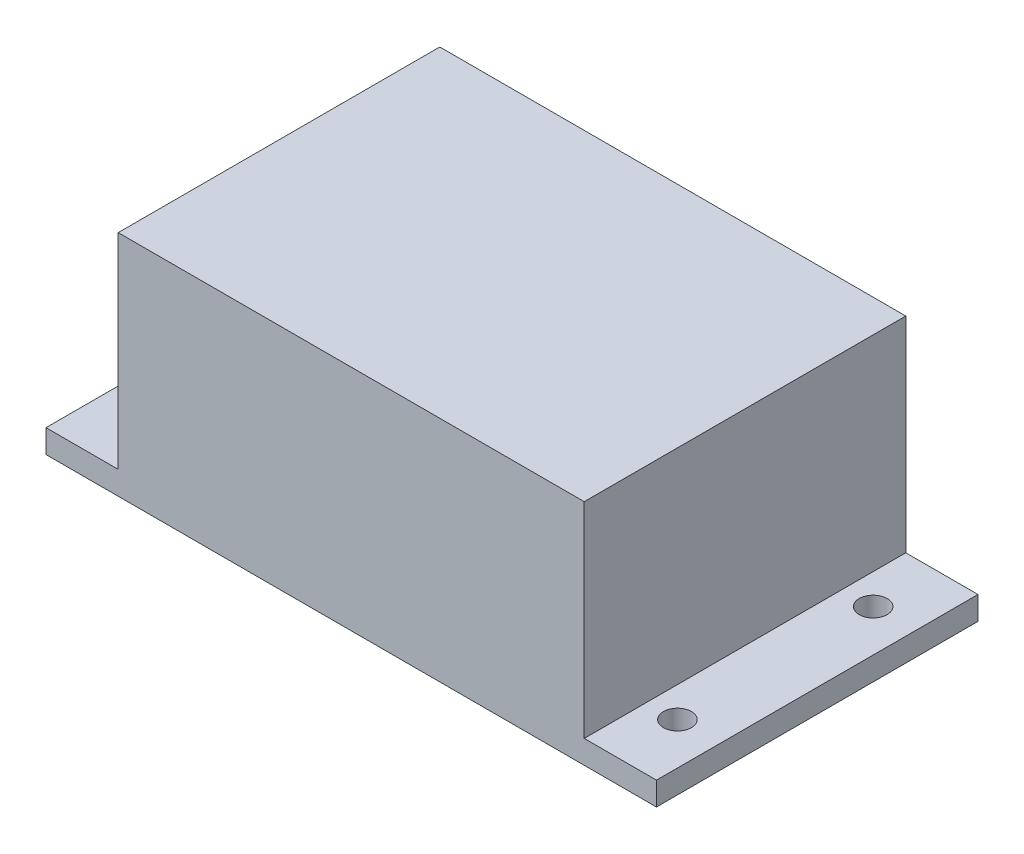
ISO-10303-21;
HEADER;
FILE_DESCRIPTION(('STEP AP214'),'2;1');
FILE_NAME('part.step','',(''),(''),'','','');
FILE_SCHEMA(('AUTOMOTIVE_DESIGN { 1 0 10303 214 1 1 1 1 }'));
ENDSEC;
DATA;
#1=APPLICATION_CONTEXT('core data for automotive mechanical design processes');
#2=APPLICATION_PROTOCOL_DEFINITION('international standard','automotive_design',2000,#1);
#3=PRODUCT_CONTEXT('',#1,'mechanical');
#4=PRODUCT('Part','Part','',(#3));
#5=PRODUCT_RELATED_PRODUCT_CATEGORY('part','',(#4));
#6=PRODUCT_DEFINITION_FORMATION('','',#4);
#7=PRODUCT_DEFINITION_CONTEXT('part definition',#1,'design');
#8=PRODUCT_DEFINITION('design','',#6,#7);
#9=PRODUCT_DEFINITION_SHAPE('','',#8);
#10=(LENGTH_UNIT() NAMED_UNIT(*) SI_UNIT(.MILLI.,.METRE.));
#11=(NAMED_UNIT(*) PLANE_ANGLE_UNIT() SI_UNIT($,.RADIAN.));
#12=(NAMED_UNIT(*) SI_UNIT($,.STERADIAN.) SOLID_ANGLE_UNIT());
#13=UNCERTAINTY_MEASURE_WITH_UNIT(LENGTH_MEASURE(1.E-05),#10,'distance_accuracy_value','');
#14=(GEOMETRIC_REPRESENTATION_CONTEXT(3) GLOBAL_UNCERTAINTY_ASSIGNED_CONTEXT((#13)) GLOBAL_UNIT_ASSIGNED_CONTEXT((#10,
#11,#12)) REPRESENTATION_CONTEXT('',''));
#15=CARTESIAN_POINT('',(0.,0.,0.));
#16=DIRECTION('',(0.,0.,1.));
#17=DIRECTION('',(1.,0.,0.));
#18=AXIS2_PLACEMENT_3D('',#15,#16,#17);
#19=CARTESIAN_POINT('',(0.,5.,-34.5));
#20=DIRECTION('',(0.,0.,-1.));
#21=DIRECTION('',(-1.,0.,0.));
#22=AXIS2_PLACEMENT_3D('',#19,#20,#21);
#23=PLANE('',#22);
#24=DIRECTION('',(1.,0.,0.));
#25=VECTOR('',#24,1.);
#26=CARTESIAN_POINT('',(0.,0.,-34.5));
#27=LINE('',#26,#25);
#28=CARTESIAN_POINT('',(-65.5,0.,-34.5));
#29=VERTEX_POINT('',#28);
#30=CARTESIAN_POINT('',(65.5,0.,-34.5));
#31=VERTEX_POINT('',#30);
#32=EDGE_CURVE('E180',#29,#31,#27,.T.);
#33=ORIENTED_EDGE('',*,*,#32,.F.);
#34=DIRECTION('',(0.,-1.,0.));
#35=VECTOR('',#34,1.);
#36=CARTESIAN_POINT('',(-65.5,5.,-34.5));
#37=LINE('',#36,#35);
#38=CARTESIAN_POINT('',(-65.5,5.,-34.5));
#39=VERTEX_POINT('',#38);
#40=EDGE_CURVE('E11',#39,#29,#37,.T.);
#41=ORIENTED_EDGE('',*,*,#40,.F.);
#42=DIRECTION('',(1.,0.,0.));
#43=VECTOR('',#42,1.);
#44=CARTESIAN_POINT('',(0.,5.,-34.5));
#45=LINE('',#44,#43);
#46=CARTESIAN_POINT('',(-50.,5.,-34.5));
#47=VERTEX_POINT('',#46);
#48=EDGE_CURVE('E169',#39,#47,#45,.T.);
#49=ORIENTED_EDGE('',*,*,#48,.T.);
#50=DIRECTION('',(0.,-1.,0.));
#51=VECTOR('',#50,1.);
#52=CARTESIAN_POINT('',(-50.,49.,-34.5));
#53=LINE('',#52,#51);
#54=CARTESIAN_POINT('',(-50.,49.,-34.5));
#55=VERTEX_POINT('',#54);
#56=EDGE_CURVE('E155',#55,#47,#53,.T.);
#57=ORIENTED_EDGE('',*,*,#56,.F.);
#58=DIRECTION('',(1.,0.,0.));
#59=VECTOR('',#58,1.);
#60=CARTESIAN_POINT('',(0.,49.,-34.5));
#61=LINE('',#60,#59);
#62=CARTESIAN_POINT('',(50.,49.,-34.5));
#63=VERTEX_POINT('',#62);
#64=EDGE_CURVE('E147',#55,#63,#61,.T.);
#65=ORIENTED_EDGE('',*,*,#64,.T.);
#66=DIRECTION('',(0.,-1.,0.));
#67=VECTOR('',#66,1.);
#68=CARTESIAN_POINT('',(50.,49.,-34.5));
#69=LINE('',#68,#67);
#70=CARTESIAN_POINT('',(50.,5.,-34.5));
#71=VERTEX_POINT('',#70);
#72=EDGE_CURVE('E158',#63,#71,#69,.T.);
#73=ORIENTED_EDGE('',*,*,#72,.T.);
#74=DIRECTION('',(1.,0.,0.));
#75=VECTOR('',#74,1.);
#76=CARTESIAN_POINT('',(0.,5.,-34.5));
#77=LINE('',#76,#75);
#78=CARTESIAN_POINT('',(65.5,5.,-34.5));
#79=VERTEX_POINT('',#78);
#80=EDGE_CURVE('E125',#71,#79,#77,.T.);
#81=ORIENTED_EDGE('',*,*,#80,.T.);
#82=DIRECTION('',(0.,-1.,0.));
#83=VECTOR('',#82,1.);
#84=CARTESIAN_POINT('',(65.5,5.,-34.5));
#85=LINE('',#84,#83);
#86=EDGE_CURVE('E132',#79,#31,#85,.T.);
#87=ORIENTED_EDGE('',*,*,#86,.T.);
#88=EDGE_LOOP('',(#33,#41,#49,#57,#65,#73,#81,#87));
#89=FACE_BOUND('',#88,.T.);
#90=ADVANCED_FACE('F34',(#89),#23,.T.);
#91=CARTESIAN_POINT('',(-65.5,5.,0.));
#92=DIRECTION('',(-1.,0.,0.));
#93=DIRECTION('',(0.,0.,1.));
#94=AXIS2_PLACEMENT_3D('',#91,#92,#93);
#95=PLANE('',#94);
#96=DIRECTION('',(0.,0.,-1.));
#97=VECTOR('',#96,1.);
#98=CARTESIAN_POINT('',(-65.5,0.,0.));
#99=LINE('',#98,#97);
#100=CARTESIAN_POINT('',(-65.5,0.,34.5));
#101=VERTEX_POINT('',#100);
#102=EDGE_CURVE('E182',#101,#29,#99,.T.);
#103=ORIENTED_EDGE('',*,*,#102,.F.);
#104=DIRECTION('',(0.,-1.,0.));
#105=VECTOR('',#104,1.);
#106=CARTESIAN_POINT('',(-65.5,5.,34.5));
#107=LINE('',#106,#105);
#108=CARTESIAN_POINT('',(-65.5,5.,34.5));
#109=VERTEX_POINT('',#108);
#110=EDGE_CURVE('E42',#109,#101,#107,.T.);
#111=ORIENTED_EDGE('',*,*,#110,.F.);
#112=DIRECTION('',(0.,0.,-1.));
#113=VECTOR('',#112,1.);
#114=CARTESIAN_POINT('',(-65.5,5.,0.));
#115=LINE('',#114,#113);
#116=EDGE_CURVE('E171',#109,#39,#115,.T.);
#117=ORIENTED_EDGE('',*,*,#116,.T.);
#118=ORIENTED_EDGE('',*,*,#40,.T.);
#119=EDGE_LOOP('',(#103,#111,#117,#118));
#120=FACE_BOUND('',#119,.T.);
#121=ADVANCED_FACE('F203',(#120),#95,.T.);
#122=CARTESIAN_POINT('',(-56.5,5.,21.));
#123=DIRECTION('',(0.,-1.,0.));
#124=DIRECTION('',(0.,0.,-1.));
#125=AXIS2_PLACEMENT_3D('',#122,#123,#124);
#126=CYLINDRICAL_SURFACE('',#125,3.00000000000001);
#127=CARTESIAN_POINT('',(-56.5,5.,21.));
#128=DIRECTION('',(0.,1.,0.));
#129=DIRECTION('',(0.,0.,1.));
#130=AXIS2_PLACEMENT_3D('',#127,#128,#129);
#131=CIRCLE('',#130,3.00000000000001);
#132=CARTESIAN_POINT('',(-56.5,5.,24.));
#133=VERTEX_POINT('',#132);
#134=EDGE_CURVE('E164',#133,#133,#131,.T.);
#135=ORIENTED_EDGE('',*,*,#134,.T.);
#136=EDGE_LOOP('',(#135));
#137=FACE_BOUND('',#136,.T.);
#138=CARTESIAN_POINT('',(-56.5,0.,21.));
#139=DIRECTION('',(0.,1.,0.));
#140=DIRECTION('',(0.,0.,1.));
#141=AXIS2_PLACEMENT_3D('',#138,#139,#140);
#142=CIRCLE('',#141,3.00000000000001);
#143=CARTESIAN_POINT('',(-56.5,0.,24.));
#144=VERTEX_POINT('',#143);
#145=EDGE_CURVE('E177',#144,#144,#142,.T.);
#146=ORIENTED_EDGE('',*,*,#145,.F.);
#147=EDGE_LOOP('',(#146));
#148=FACE_BOUND('',#147,.T.);
#149=ADVANCED_FACE('F205',(#137,#148),#126,.F.);
#150=CARTESIAN_POINT('',(-56.5,5.,-21.));
#151=DIRECTION('',(0.,-1.,0.));
#152=DIRECTION('',(0.,0.,-1.));
#153=AXIS2_PLACEMENT_3D('',#150,#151,#152);
#154=CYLINDRICAL_SURFACE('',#153,3.00000000000001);
#155=CARTESIAN_POINT('',(-56.5,5.,-21.));
#156=DIRECTION('',(0.,1.,0.));
#157=DIRECTION('',(0.,0.,1.));
#158=AXIS2_PLACEMENT_3D('',#155,#156,#157);
#159=CIRCLE('',#158,3.00000000000001);
#160=CARTESIAN_POINT('',(-56.5,5.,-18.));
#161=VERTEX_POINT('',#160);
#162=EDGE_CURVE('E161',#161,#161,#159,.T.);
#163=ORIENTED_EDGE('',*,*,#162,.T.);
#164=EDGE_LOOP('',(#163));
#165=FACE_BOUND('',#164,.T.);
#166=CARTESIAN_POINT('',(-56.5,0.,-21.));
#167=DIRECTION('',(0.,1.,0.));
#168=DIRECTION('',(0.,0.,1.));
#169=AXIS2_PLACEMENT_3D('',#166,#167,#168);
#170=CIRCLE('',#169,3.00000000000001);
#171=CARTESIAN_POINT('',(-56.5,0.,-18.));
#172=VERTEX_POINT('',#171);
#173=EDGE_CURVE('E160',#172,#172,#170,.T.);
#174=ORIENTED_EDGE('',*,*,#173,.F.);
#175=EDGE_LOOP('',(#174));
#176=FACE_BOUND('',#175,.T.);
#177=ADVANCED_FACE('F36',(#165,#176),#154,.F.);
#178=CARTESIAN_POINT('',(0.,5.,34.5));
#179=DIRECTION('',(0.,0.,-1.));
#180=DIRECTION('',(-1.,0.,0.));
#181=AXIS2_PLACEMENT_3D('',#178,#179,#180);
#182=PLANE('',#181);
#183=DIRECTION('',(1.,0.,0.));
#184=VECTOR('',#183,1.);
#185=CARTESIAN_POINT('',(0.,0.,34.5));
#186=LINE('',#185,#184);
#187=CARTESIAN_POINT('',(65.5,0.,34.5));
#188=VERTEX_POINT('',#187);
#189=EDGE_CURVE('E165',#101,#188,#186,.T.);
#190=ORIENTED_EDGE('',*,*,#189,.T.);
#191=DIRECTION('',(0.,-1.,0.));
#192=VECTOR('',#191,1.);
#193=CARTESIAN_POINT('',(65.5,5.,34.5));
#194=LINE('',#193,#192);
#195=CARTESIAN_POINT('',(65.5,5.,34.5));
#196=VERTEX_POINT('',#195);
#197=EDGE_CURVE('E118',#196,#188,#194,.T.);
#198=ORIENTED_EDGE('',*,*,#197,.F.);
#199=DIRECTION('',(1.,0.,0.));
#200=VECTOR('',#199,1.);
#201=CARTESIAN_POINT('',(0.,5.,34.5));
#202=LINE('',#201,#200);
#203=CARTESIAN_POINT('',(50.,5.,34.5));
#204=VERTEX_POINT('',#203);
#205=EDGE_CURVE('E115',#204,#196,#202,.T.);
#206=ORIENTED_EDGE('',*,*,#205,.F.);
#207=DIRECTION('',(0.,-1.,0.));
#208=VECTOR('',#207,1.);
#209=CARTESIAN_POINT('',(50.,49.,34.5));
#210=LINE('',#209,#208);
#211=CARTESIAN_POINT('',(50.,49.,34.5));
#212=VERTEX_POINT('',#211);
#213=EDGE_CURVE('E104',#212,#204,#210,.T.);
#214=ORIENTED_EDGE('',*,*,#213,.F.);
#215=DIRECTION('',(1.,0.,0.));
#216=VECTOR('',#215,1.);
#217=CARTESIAN_POINT('',(0.,49.,34.5));
#218=LINE('',#217,#216);
#219=CARTESIAN_POINT('',(-50.,49.,34.5));
#220=VERTEX_POINT('',#219);
#221=EDGE_CURVE('E111',#220,#212,#218,.T.);
#222=ORIENTED_EDGE('',*,*,#221,.F.);
#223=DIRECTION('',(0.,-1.,0.));
#224=VECTOR('',#223,1.);
#225=CARTESIAN_POINT('',(-50.,49.,34.5));
#226=LINE('',#225,#224);
#227=CARTESIAN_POINT('',(-50.,5.,34.5));
#228=VERTEX_POINT('',#227);
#229=EDGE_CURVE('E110',#220,#228,#226,.T.);
#230=ORIENTED_EDGE('',*,*,#229,.T.);
#231=DIRECTION('',(1.,0.,0.));
#232=VECTOR('',#231,1.);
#233=CARTESIAN_POINT('',(0.,5.,34.5));
#234=LINE('',#233,#232);
#235=EDGE_CURVE('E173',#109,#228,#234,.T.);
#236=ORIENTED_EDGE('',*,*,#235,.F.);
#237=ORIENTED_EDGE('',*,*,#110,.T.);
#238=EDGE_LOOP('',(#190,#198,#206,#214,#222,#230,#236,#237));
#239=FACE_BOUND('',#238,.T.);
#240=ADVANCED_FACE('F116',(#239),#182,.F.);
#241=CARTESIAN_POINT('',(0.,5.,0.));
#242=DIRECTION('',(0.,1.,0.));
#243=DIRECTION('',(0.,0.,1.));
#244=AXIS2_PLACEMENT_3D('',#241,#242,#243);
#245=PLANE('',#244);
#246=ORIENTED_EDGE('',*,*,#162,.F.);
#247=EDGE_LOOP('',(#246));
#248=FACE_BOUND('',#247,.T.);
#249=ORIENTED_EDGE('',*,*,#134,.F.);
#250=EDGE_LOOP('',(#249));
#251=FACE_BOUND('',#250,.T.);
#252=DIRECTION('',(0.,0.,1.));
#253=VECTOR('',#252,1.);
#254=CARTESIAN_POINT('',(-50.,5.,0.));
#255=LINE('',#254,#253);
#256=EDGE_CURVE('E75',#47,#228,#255,.T.);
#257=ORIENTED_EDGE('',*,*,#256,.F.);
#258=ORIENTED_EDGE('',*,*,#48,.F.);
#259=ORIENTED_EDGE('',*,*,#116,.F.);
#260=ORIENTED_EDGE('',*,*,#235,.T.);
#261=EDGE_LOOP('',(#257,#258,#259,#260));
#262=FACE_BOUND('',#261,.T.);
#263=ADVANCED_FACE('F202',(#248,#251,#262),#245,.T.);
#264=CARTESIAN_POINT('',(0.,0.,0.));
#265=DIRECTION('',(0.,1.,0.));
#266=DIRECTION('',(0.,0.,1.));
#267=AXIS2_PLACEMENT_3D('',#264,#265,#266);
#268=PLANE('',#267);
#269=ORIENTED_EDGE('',*,*,#173,.T.);
#270=EDGE_LOOP('',(#269));
#271=FACE_BOUND('',#270,.T.);
#272=ORIENTED_EDGE('',*,*,#145,.T.);
#273=EDGE_LOOP('',(#272));
#274=FACE_BOUND('',#273,.T.);
#275=ORIENTED_EDGE('',*,*,#32,.T.);
#276=DIRECTION('',(0.,0.,-1.));
#277=VECTOR('',#276,1.);
#278=CARTESIAN_POINT('',(65.5,0.,0.));
#279=LINE('',#278,#277);
#280=EDGE_CURVE('E139',#188,#31,#279,.T.);
#281=ORIENTED_EDGE('',*,*,#280,.F.);
#282=ORIENTED_EDGE('',*,*,#189,.F.);
#283=ORIENTED_EDGE('',*,*,#102,.T.);
#284=EDGE_LOOP('',(#275,#281,#282,#283));
#285=FACE_BOUND('',#284,.T.);
#286=CARTESIAN_POINT('',(56.5,0.,21.));
#287=DIRECTION('',(0.,1.,0.));
#288=DIRECTION('',(0.,0.,1.));
#289=AXIS2_PLACEMENT_3D('',#286,#287,#288);
#290=CIRCLE('',#289,3.00000000000001);
#291=CARTESIAN_POINT('',(56.5,0.,24.));
#292=VERTEX_POINT('',#291);
#293=EDGE_CURVE('E133',#292,#292,#290,.T.);
#294=ORIENTED_EDGE('',*,*,#293,.T.);
#295=EDGE_LOOP('',(#294));
#296=FACE_BOUND('',#295,.T.);
#297=CARTESIAN_POINT('',(56.5,0.,-21.));
#298=DIRECTION('',(0.,1.,0.));
#299=DIRECTION('',(0.,0.,1.));
#300=AXIS2_PLACEMENT_3D('',#297,#298,#299);
#301=CIRCLE('',#300,3.00000000000001);
#302=CARTESIAN_POINT('',(56.5,0.,-18.));
#303=VERTEX_POINT('',#302);
#304=EDGE_CURVE('E136',#303,#303,#301,.T.);
#305=ORIENTED_EDGE('',*,*,#304,.T.);
#306=EDGE_LOOP('',(#305));
#307=FACE_BOUND('',#306,.T.);
#308=ADVANCED_FACE('F187',(#271,#274,#285,#296,#307),#268,.F.);
#309=CARTESIAN_POINT('',(-50.,49.,0.));
#310=DIRECTION('',(1.,0.,0.));
#311=DIRECTION('',(0.,0.,-1.));
#312=AXIS2_PLACEMENT_3D('',#309,#310,#311);
#313=PLANE('',#312);
#314=ORIENTED_EDGE('',*,*,#56,.T.);
#315=ORIENTED_EDGE('',*,*,#256,.T.);
#316=ORIENTED_EDGE('',*,*,#229,.F.);
#317=DIRECTION('',(0.,0.,1.));
#318=VECTOR('',#317,1.);
#319=CARTESIAN_POINT('',(-50.,49.,0.));
#320=LINE('',#319,#318);
#321=EDGE_CURVE('E150',#55,#220,#320,.T.);
#322=ORIENTED_EDGE('',*,*,#321,.F.);
#323=EDGE_LOOP('',(#314,#315,#316,#322));
#324=FACE_BOUND('',#323,.T.);
#325=ADVANCED_FACE('F201',(#324),#313,.F.);
#326=CARTESIAN_POINT('',(50.,49.,0.));
#327=DIRECTION('',(1.,0.,0.));
#328=DIRECTION('',(0.,0.,-1.));
#329=AXIS2_PLACEMENT_3D('',#326,#327,#328);
#330=PLANE('',#329);
#331=DIRECTION('',(0.,0.,1.));
#332=VECTOR('',#331,1.);
#333=CARTESIAN_POINT('',(50.,5.,0.));
#334=LINE('',#333,#332);
#335=EDGE_CURVE('E49',#71,#204,#334,.T.);
#336=ORIENTED_EDGE('',*,*,#335,.F.);
#337=ORIENTED_EDGE('',*,*,#72,.F.);
#338=DIRECTION('',(0.,0.,1.));
#339=VECTOR('',#338,1.);
#340=CARTESIAN_POINT('',(50.,49.,0.));
#341=LINE('',#340,#339);
#342=EDGE_CURVE('E108',#63,#212,#341,.T.);
#343=ORIENTED_EDGE('',*,*,#342,.T.);
#344=ORIENTED_EDGE('',*,*,#213,.T.);
#345=EDGE_LOOP('',(#336,#337,#343,#344));
#346=FACE_BOUND('',#345,.T.);
#347=ADVANCED_FACE('F106',(#346),#330,.T.);
#348=CARTESIAN_POINT('',(0.,49.,0.));
#349=DIRECTION('',(0.,1.,0.));
#350=DIRECTION('',(0.,0.,1.));
#351=AXIS2_PLACEMENT_3D('',#348,#349,#350);
#352=PLANE('',#351);
#353=ORIENTED_EDGE('',*,*,#342,.F.);
#354=ORIENTED_EDGE('',*,*,#64,.F.);
#355=ORIENTED_EDGE('',*,*,#321,.T.);
#356=ORIENTED_EDGE('',*,*,#221,.T.);
#357=EDGE_LOOP('',(#353,#354,#355,#356));
#358=FACE_BOUND('',#357,.T.);
#359=ADVANCED_FACE('F196',(#358),#352,.T.);
#360=CARTESIAN_POINT('',(56.5,5.,-21.));
#361=DIRECTION('',(0.,-1.,0.));
#362=DIRECTION('',(0.,0.,-1.));
#363=AXIS2_PLACEMENT_3D('',#360,#361,#362);
#364=CYLINDRICAL_SURFACE('',#363,3.00000000000001);
#365=CARTESIAN_POINT('',(56.5,5.,-21.));
#366=DIRECTION('',(0.,1.,0.));
#367=DIRECTION('',(0.,0.,1.));
#368=AXIS2_PLACEMENT_3D('',#365,#366,#367);
#369=CIRCLE('',#368,3.00000000000001);
#370=CARTESIAN_POINT('',(56.5,5.,-18.));
#371=VERTEX_POINT('',#370);
#372=EDGE_CURVE('E127',#371,#371,#369,.T.);
#373=ORIENTED_EDGE('',*,*,#372,.T.);
#374=EDGE_LOOP('',(#373));
#375=FACE_BOUND('',#374,.T.);
#376=ORIENTED_EDGE('',*,*,#304,.F.);
#377=EDGE_LOOP('',(#376));
#378=FACE_BOUND('',#377,.T.);
#379=ADVANCED_FACE('F228',(#375,#378),#364,.F.);
#380=CARTESIAN_POINT('',(56.5,5.,21.));
#381=DIRECTION('',(0.,-1.,0.));
#382=DIRECTION('',(0.,0.,-1.));
#383=AXIS2_PLACEMENT_3D('',#380,#381,#382);
#384=CYLINDRICAL_SURFACE('',#383,3.00000000000001);
#385=CARTESIAN_POINT('',(56.5,5.,21.));
#386=DIRECTION('',(0.,1.,0.));
#387=DIRECTION('',(0.,0.,1.));
#388=AXIS2_PLACEMENT_3D('',#385,#386,#387);
#389=CIRCLE('',#388,3.00000000000001);
#390=CARTESIAN_POINT('',(56.5,5.,24.));
#391=VERTEX_POINT('',#390);
#392=EDGE_CURVE('E142',#391,#391,#389,.T.);
#393=ORIENTED_EDGE('',*,*,#392,.T.);
#394=EDGE_LOOP('',(#393));
#395=FACE_BOUND('',#394,.T.);
#396=ORIENTED_EDGE('',*,*,#293,.F.);
#397=EDGE_LOOP('',(#396));
#398=FACE_BOUND('',#397,.T.);
#399=ADVANCED_FACE('F229',(#395,#398),#384,.F.);
#400=CARTESIAN_POINT('',(65.5,5.,0.));
#401=DIRECTION('',(-1.,0.,0.));
#402=DIRECTION('',(0.,0.,1.));
#403=AXIS2_PLACEMENT_3D('',#400,#401,#402);
#404=PLANE('',#403);
#405=ORIENTED_EDGE('',*,*,#280,.T.);
#406=ORIENTED_EDGE('',*,*,#86,.F.);
#407=DIRECTION('',(0.,0.,-1.));
#408=VECTOR('',#407,1.);
#409=CARTESIAN_POINT('',(65.5,5.,0.));
#410=LINE('',#409,#408);
#411=EDGE_CURVE('E120',#196,#79,#410,.T.);
#412=ORIENTED_EDGE('',*,*,#411,.F.);
#413=ORIENTED_EDGE('',*,*,#197,.T.);
#414=EDGE_LOOP('',(#405,#406,#412,#413));
#415=FACE_BOUND('',#414,.T.);
#416=ADVANCED_FACE('F192',(#415),#404,.F.);
#417=CARTESIAN_POINT('',(0.,5.,0.));
#418=DIRECTION('',(0.,1.,0.));
#419=DIRECTION('',(0.,0.,1.));
#420=AXIS2_PLACEMENT_3D('',#417,#418,#419);
#421=PLANE('',#420);
#422=ORIENTED_EDGE('',*,*,#392,.F.);
#423=EDGE_LOOP('',(#422));
#424=FACE_BOUND('',#423,.T.);
#425=ORIENTED_EDGE('',*,*,#372,.F.);
#426=EDGE_LOOP('',(#425));
#427=FACE_BOUND('',#426,.T.);
#428=ORIENTED_EDGE('',*,*,#80,.F.);
#429=ORIENTED_EDGE('',*,*,#335,.T.);
#430=ORIENTED_EDGE('',*,*,#205,.T.);
#431=ORIENTED_EDGE('',*,*,#411,.T.);
#432=EDGE_LOOP('',(#428,#429,#430,#431));
#433=FACE_BOUND('',#432,.T.);
#434=ADVANCED_FACE('F123',(#424,#427,#433),#421,.T.);
#435=CLOSED_SHELL('',(#90,#121,#149,#177,#240,#263,#308,#325,#347,#359,#379,#399,#416,#434));
#436=MANIFOLD_SOLID_BREP('B2',#435);
#437=ADVANCED_BREP_SHAPE_REPRESENTATION('',(#18,#436),#14);
#438=SHAPE_DEFINITION_REPRESENTATION(#9,#437);
ENDSEC;
END-ISO-10303-21;
